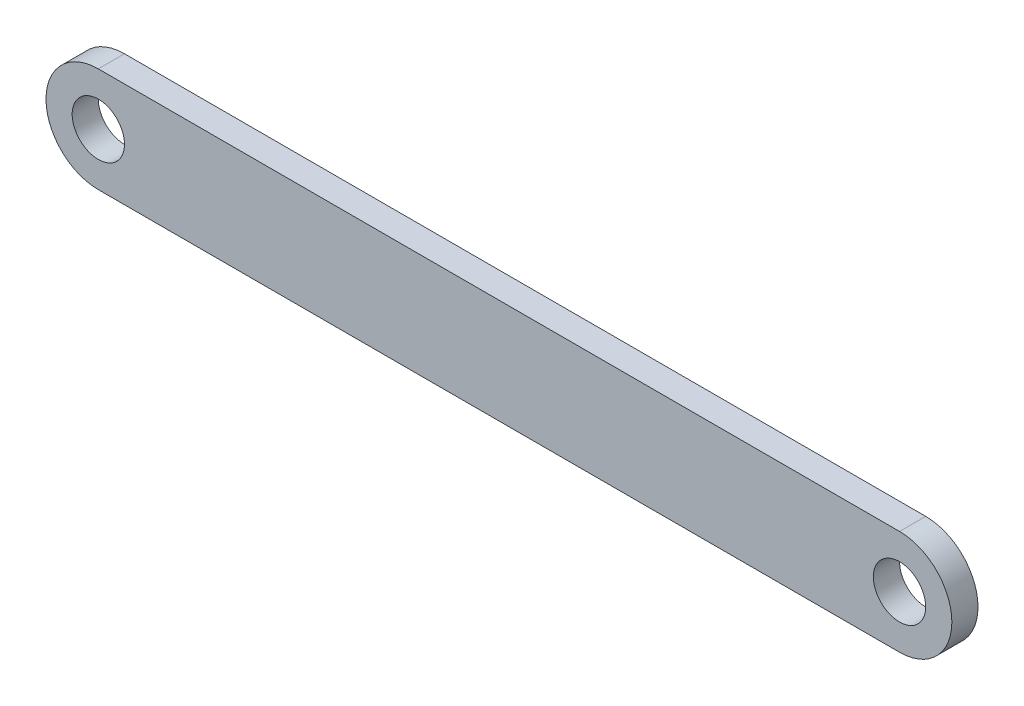
ISO-10303-21;
HEADER;
FILE_DESCRIPTION(('STEP AP214'),'2;1');
FILE_NAME('part.step','',(''),(''),'','','');
FILE_SCHEMA(('AUTOMOTIVE_DESIGN { 1 0 10303 214 1 1 1 1 }'));
ENDSEC;
DATA;
#1=APPLICATION_CONTEXT('core data for automotive mechanical design processes');
#2=APPLICATION_PROTOCOL_DEFINITION('international standard','automotive_design',2000,#1);
#3=PRODUCT_CONTEXT('',#1,'mechanical');
#4=PRODUCT('Part','Part','',(#3));
#5=PRODUCT_RELATED_PRODUCT_CATEGORY('part','',(#4));
#6=PRODUCT_DEFINITION_FORMATION('','',#4);
#7=PRODUCT_DEFINITION_CONTEXT('part definition',#1,'design');
#8=PRODUCT_DEFINITION('design','',#6,#7);
#9=PRODUCT_DEFINITION_SHAPE('','',#8);
#10=(LENGTH_UNIT() NAMED_UNIT(*) SI_UNIT(.MILLI.,.METRE.));
#11=(NAMED_UNIT(*) PLANE_ANGLE_UNIT() SI_UNIT($,.RADIAN.));
#12=(NAMED_UNIT(*) SI_UNIT($,.STERADIAN.) SOLID_ANGLE_UNIT());
#13=UNCERTAINTY_MEASURE_WITH_UNIT(LENGTH_MEASURE(1.E-05),#10,'distance_accuracy_value','');
#14=(GEOMETRIC_REPRESENTATION_CONTEXT(3) GLOBAL_UNCERTAINTY_ASSIGNED_CONTEXT((#13)) GLOBAL_UNIT_ASSIGNED_CONTEXT((#10,
#11,#12)) REPRESENTATION_CONTEXT('',''));
#15=CARTESIAN_POINT('',(0.,0.,0.));
#16=DIRECTION('',(0.,0.,1.));
#17=DIRECTION('',(1.,0.,0.));
#18=AXIS2_PLACEMENT_3D('',#15,#16,#17);
#19=CARTESIAN_POINT('',(15.315,0.,1.));
#20=DIRECTION('',(0.,0.,-1.));
#21=DIRECTION('',(-1.,0.,0.));
#22=AXIS2_PLACEMENT_3D('',#19,#20,#21);
#23=PLANE('',#22);
#24=CARTESIAN_POINT('',(15.315,0.,1.));
#25=DIRECTION('',(0.,0.,1.));
#26=DIRECTION('',(-1.,0.,0.));
#27=AXIS2_PLACEMENT_3D('',#24,#25,#26);
#28=CIRCLE('',#27,2.);
#29=CARTESIAN_POINT('',(15.315,-2.,1.));
#30=VERTEX_POINT('',#29);
#31=CARTESIAN_POINT('',(15.315,2.,1.));
#32=VERTEX_POINT('',#31);
#33=EDGE_CURVE('E96',#30,#32,#28,.T.);
#34=ORIENTED_EDGE('',*,*,#33,.T.);
#35=DIRECTION('',(-1.,0.,0.));
#36=VECTOR('',#35,1.);
#37=CARTESIAN_POINT('',(-15.315,2.,1.));
#38=LINE('',#37,#36);
#39=CARTESIAN_POINT('',(-15.315,2.,1.));
#40=VERTEX_POINT('',#39);
#41=EDGE_CURVE('E91',#32,#40,#38,.T.);
#42=ORIENTED_EDGE('',*,*,#41,.T.);
#43=CARTESIAN_POINT('',(-15.315,0.,1.));
#44=DIRECTION('',(0.,0.,1.));
#45=DIRECTION('',(1.,0.,0.));
#46=AXIS2_PLACEMENT_3D('',#43,#44,#45);
#47=CIRCLE('',#46,2.);
#48=CARTESIAN_POINT('',(-15.315,-2.,1.));
#49=VERTEX_POINT('',#48);
#50=EDGE_CURVE('E94',#40,#49,#47,.T.);
#51=ORIENTED_EDGE('',*,*,#50,.T.);
#52=DIRECTION('',(1.,0.,0.));
#53=VECTOR('',#52,1.);
#54=CARTESIAN_POINT('',(-15.315,-2.,1.));
#55=LINE('',#54,#53);
#56=EDGE_CURVE('E61',#49,#30,#55,.T.);
#57=ORIENTED_EDGE('',*,*,#56,.T.);
#58=EDGE_LOOP('',(#34,#42,#51,#57));
#59=FACE_BOUND('',#58,.T.);
#60=CARTESIAN_POINT('',(-15.315,0.,1.));
#61=DIRECTION('',(0.,0.,1.));
#62=DIRECTION('',(1.,0.,0.));
#63=AXIS2_PLACEMENT_3D('',#60,#61,#62);
#64=CIRCLE('',#63,1.);
#65=CARTESIAN_POINT('',(-14.315,0.,1.));
#66=VERTEX_POINT('',#65);
#67=EDGE_CURVE('E116',#66,#66,#64,.T.);
#68=ORIENTED_EDGE('',*,*,#67,.F.);
#69=EDGE_LOOP('',(#68));
#70=FACE_BOUND('',#69,.T.);
#71=CARTESIAN_POINT('',(15.315,0.,1.));
#72=DIRECTION('',(0.,0.,1.));
#73=DIRECTION('',(1.,0.,0.));
#74=AXIS2_PLACEMENT_3D('',#71,#72,#73);
#75=CIRCLE('',#74,1.);
#76=CARTESIAN_POINT('',(16.315,0.,1.));
#77=VERTEX_POINT('',#76);
#78=EDGE_CURVE('E138',#77,#77,#75,.T.);
#79=ORIENTED_EDGE('',*,*,#78,.F.);
#80=EDGE_LOOP('',(#79));
#81=FACE_BOUND('',#80,.T.);
#82=ADVANCED_FACE('F43',(#59,#70,#81),#23,.F.);
#83=CARTESIAN_POINT('',(15.315,0.,0.));
#84=DIRECTION('',(0.,0.,-1.));
#85=DIRECTION('',(-1.,0.,0.));
#86=AXIS2_PLACEMENT_3D('',#83,#84,#85);
#87=PLANE('',#86);
#88=CARTESIAN_POINT('',(-15.315,0.,0.));
#89=DIRECTION('',(0.,0.,1.));
#90=DIRECTION('',(1.,0.,0.));
#91=AXIS2_PLACEMENT_3D('',#88,#89,#90);
#92=CIRCLE('',#91,1.);
#93=CARTESIAN_POINT('',(-14.315,0.,0.));
#94=VERTEX_POINT('',#93);
#95=EDGE_CURVE('E134',#94,#94,#92,.T.);
#96=ORIENTED_EDGE('',*,*,#95,.T.);
#97=EDGE_LOOP('',(#96));
#98=FACE_BOUND('',#97,.T.);
#99=CARTESIAN_POINT('',(15.315,0.,0.));
#100=DIRECTION('',(0.,0.,1.));
#101=DIRECTION('',(-1.,0.,0.));
#102=AXIS2_PLACEMENT_3D('',#99,#100,#101);
#103=CIRCLE('',#102,2.);
#104=CARTESIAN_POINT('',(15.315,-2.,0.));
#105=VERTEX_POINT('',#104);
#106=CARTESIAN_POINT('',(15.315,2.,0.));
#107=VERTEX_POINT('',#106);
#108=EDGE_CURVE('E112',#105,#107,#103,.T.);
#109=ORIENTED_EDGE('',*,*,#108,.F.);
#110=DIRECTION('',(1.,0.,0.));
#111=VECTOR('',#110,1.);
#112=CARTESIAN_POINT('',(-15.315,-2.,0.));
#113=LINE('',#112,#111);
#114=CARTESIAN_POINT('',(-15.315,-2.,0.));
#115=VERTEX_POINT('',#114);
#116=EDGE_CURVE('E84',#115,#105,#113,.T.);
#117=ORIENTED_EDGE('',*,*,#116,.F.);
#118=CARTESIAN_POINT('',(-15.315,0.,0.));
#119=DIRECTION('',(0.,0.,1.));
#120=DIRECTION('',(1.,0.,0.));
#121=AXIS2_PLACEMENT_3D('',#118,#119,#120);
#122=CIRCLE('',#121,2.);
#123=CARTESIAN_POINT('',(-15.315,2.,0.));
#124=VERTEX_POINT('',#123);
#125=EDGE_CURVE('E78',#124,#115,#122,.T.);
#126=ORIENTED_EDGE('',*,*,#125,.F.);
#127=DIRECTION('',(-1.,0.,0.));
#128=VECTOR('',#127,1.);
#129=CARTESIAN_POINT('',(-15.315,2.,0.));
#130=LINE('',#129,#128);
#131=EDGE_CURVE('E101',#107,#124,#130,.T.);
#132=ORIENTED_EDGE('',*,*,#131,.F.);
#133=EDGE_LOOP('',(#109,#117,#126,#132));
#134=FACE_BOUND('',#133,.T.);
#135=CARTESIAN_POINT('',(15.315,0.,0.));
#136=DIRECTION('',(0.,0.,1.));
#137=DIRECTION('',(1.,0.,0.));
#138=AXIS2_PLACEMENT_3D('',#135,#136,#137);
#139=CIRCLE('',#138,1.);
#140=CARTESIAN_POINT('',(16.315,0.,0.));
#141=VERTEX_POINT('',#140);
#142=EDGE_CURVE('E142',#141,#141,#139,.T.);
#143=ORIENTED_EDGE('',*,*,#142,.T.);
#144=EDGE_LOOP('',(#143));
#145=FACE_BOUND('',#144,.T.);
#146=ADVANCED_FACE('F129',(#98,#134,#145),#87,.T.);
#147=CARTESIAN_POINT('',(15.315,0.,1.));
#148=DIRECTION('',(0.,0.,-1.));
#149=DIRECTION('',(-1.,0.,0.));
#150=AXIS2_PLACEMENT_3D('',#147,#148,#149);
#151=CYLINDRICAL_SURFACE('',#150,2.);
#152=ORIENTED_EDGE('',*,*,#108,.T.);
#153=DIRECTION('',(0.,0.,-1.));
#154=VECTOR('',#153,1.);
#155=CARTESIAN_POINT('',(15.315,2.,1.));
#156=LINE('',#155,#154);
#157=EDGE_CURVE('E11',#32,#107,#156,.T.);
#158=ORIENTED_EDGE('',*,*,#157,.F.);
#159=ORIENTED_EDGE('',*,*,#33,.F.);
#160=DIRECTION('',(0.,0.,-1.));
#161=VECTOR('',#160,1.);
#162=CARTESIAN_POINT('',(15.315,-2.,1.));
#163=LINE('',#162,#161);
#164=EDGE_CURVE('E108',#30,#105,#163,.T.);
#165=ORIENTED_EDGE('',*,*,#164,.T.);
#166=EDGE_LOOP('',(#152,#158,#159,#165));
#167=FACE_BOUND('',#166,.T.);
#168=ADVANCED_FACE('F45',(#167),#151,.T.);
#169=CARTESIAN_POINT('',(-15.315,2.,1.));
#170=DIRECTION('',(0.,-1.,0.));
#171=DIRECTION('',(0.,0.,-1.));
#172=AXIS2_PLACEMENT_3D('',#169,#170,#171);
#173=PLANE('',#172);
#174=ORIENTED_EDGE('',*,*,#131,.T.);
#175=DIRECTION('',(0.,0.,-1.));
#176=VECTOR('',#175,1.);
#177=CARTESIAN_POINT('',(-15.315,2.,1.));
#178=LINE('',#177,#176);
#179=EDGE_CURVE('E53',#40,#124,#178,.T.);
#180=ORIENTED_EDGE('',*,*,#179,.F.);
#181=ORIENTED_EDGE('',*,*,#41,.F.);
#182=ORIENTED_EDGE('',*,*,#157,.T.);
#183=EDGE_LOOP('',(#174,#180,#181,#182));
#184=FACE_BOUND('',#183,.T.);
#185=ADVANCED_FACE('F100',(#184),#173,.F.);
#186=CARTESIAN_POINT('',(-15.315,0.,1.));
#187=DIRECTION('',(0.,0.,-1.));
#188=DIRECTION('',(-1.,0.,0.));
#189=AXIS2_PLACEMENT_3D('',#186,#187,#188);
#190=CYLINDRICAL_SURFACE('',#189,2.);
#191=ORIENTED_EDGE('',*,*,#125,.T.);
#192=DIRECTION('',(0.,0.,-1.));
#193=VECTOR('',#192,1.);
#194=CARTESIAN_POINT('',(-15.315,-2.,1.));
#195=LINE('',#194,#193);
#196=EDGE_CURVE('E103',#49,#115,#195,.T.);
#197=ORIENTED_EDGE('',*,*,#196,.F.);
#198=ORIENTED_EDGE('',*,*,#50,.F.);
#199=ORIENTED_EDGE('',*,*,#179,.T.);
#200=EDGE_LOOP('',(#191,#197,#198,#199));
#201=FACE_BOUND('',#200,.T.);
#202=ADVANCED_FACE('F104',(#201),#190,.T.);
#203=CARTESIAN_POINT('',(-15.315,-2.,1.));
#204=DIRECTION('',(0.,1.,0.));
#205=DIRECTION('',(0.,0.,1.));
#206=AXIS2_PLACEMENT_3D('',#203,#204,#205);
#207=PLANE('',#206);
#208=ORIENTED_EDGE('',*,*,#116,.T.);
#209=ORIENTED_EDGE('',*,*,#164,.F.);
#210=ORIENTED_EDGE('',*,*,#56,.F.);
#211=ORIENTED_EDGE('',*,*,#196,.T.);
#212=EDGE_LOOP('',(#208,#209,#210,#211));
#213=FACE_BOUND('',#212,.T.);
#214=ADVANCED_FACE('F126',(#213),#207,.F.);
#215=CARTESIAN_POINT('',(-15.315,0.,1.));
#216=DIRECTION('',(0.,0.,-1.));
#217=DIRECTION('',(-1.,0.,0.));
#218=AXIS2_PLACEMENT_3D('',#215,#216,#217);
#219=CYLINDRICAL_SURFACE('',#218,1.);
#220=ORIENTED_EDGE('',*,*,#67,.T.);
#221=EDGE_LOOP('',(#220));
#222=FACE_BOUND('',#221,.T.);
#223=ORIENTED_EDGE('',*,*,#95,.F.);
#224=EDGE_LOOP('',(#223));
#225=FACE_BOUND('',#224,.T.);
#226=ADVANCED_FACE('F161',(#222,#225),#219,.F.);
#227=CARTESIAN_POINT('',(15.315,0.,1.));
#228=DIRECTION('',(0.,0.,-1.));
#229=DIRECTION('',(-1.,0.,0.));
#230=AXIS2_PLACEMENT_3D('',#227,#228,#229);
#231=CYLINDRICAL_SURFACE('',#230,1.);
#232=ORIENTED_EDGE('',*,*,#78,.T.);
#233=EDGE_LOOP('',(#232));
#234=FACE_BOUND('',#233,.T.);
#235=ORIENTED_EDGE('',*,*,#142,.F.);
#236=EDGE_LOOP('',(#235));
#237=FACE_BOUND('',#236,.T.);
#238=ADVANCED_FACE('F150',(#234,#237),#231,.F.);
#239=CLOSED_SHELL('',(#82,#146,#168,#185,#202,#214,#226,#238));
#240=MANIFOLD_SOLID_BREP('B2',#239);
#241=ADVANCED_BREP_SHAPE_REPRESENTATION('',(#18,#240),#14);
#242=SHAPE_DEFINITION_REPRESENTATION(#9,#241);
ENDSEC;
END-ISO-10303-21;
